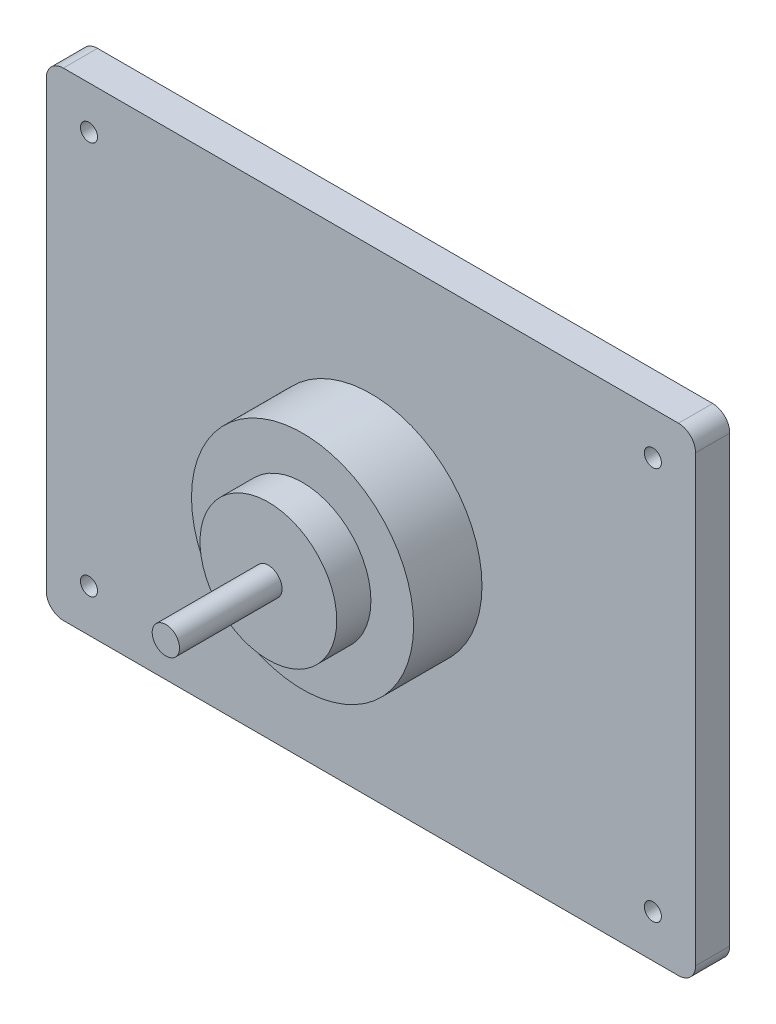
ISO-10303-21;
HEADER;
FILE_DESCRIPTION(('STEP AP214'),'2;1');
FILE_NAME('part.step','',(''),(''),'','','');
FILE_SCHEMA(('AUTOMOTIVE_DESIGN { 1 0 10303 214 1 1 1 1 }'));
ENDSEC;
DATA;
#1=APPLICATION_CONTEXT('core data for automotive mechanical design processes');
#2=APPLICATION_PROTOCOL_DEFINITION('international standard','automotive_design',2000,#1);
#3=PRODUCT_CONTEXT('',#1,'mechanical');
#4=PRODUCT('Part','Part','',(#3));
#5=PRODUCT_RELATED_PRODUCT_CATEGORY('part','',(#4));
#6=PRODUCT_DEFINITION_FORMATION('','',#4);
#7=PRODUCT_DEFINITION_CONTEXT('part definition',#1,'design');
#8=PRODUCT_DEFINITION('design','',#6,#7);
#9=PRODUCT_DEFINITION_SHAPE('','',#8);
#10=(LENGTH_UNIT() NAMED_UNIT(*) SI_UNIT(.MILLI.,.METRE.));
#11=(NAMED_UNIT(*) PLANE_ANGLE_UNIT() SI_UNIT($,.RADIAN.));
#12=(NAMED_UNIT(*) SI_UNIT($,.STERADIAN.) SOLID_ANGLE_UNIT());
#13=UNCERTAINTY_MEASURE_WITH_UNIT(LENGTH_MEASURE(1.E-05),#10,'distance_accuracy_value','');
#14=(GEOMETRIC_REPRESENTATION_CONTEXT(3) GLOBAL_UNCERTAINTY_ASSIGNED_CONTEXT((#13)) GLOBAL_UNIT_ASSIGNED_CONTEXT((#10,
#11,#12)) REPRESENTATION_CONTEXT('',''));
#15=CARTESIAN_POINT('',(0.,0.,0.));
#16=DIRECTION('',(0.,0.,1.));
#17=DIRECTION('',(1.,0.,0.));
#18=AXIS2_PLACEMENT_3D('',#15,#16,#17);
#19=CARTESIAN_POINT('',(-95.,-70.,10.));
#20=DIRECTION('',(0.,1.,0.));
#21=DIRECTION('',(0.,0.,1.));
#22=AXIS2_PLACEMENT_3D('',#19,#20,#21);
#23=PLANE('',#22);
#24=DIRECTION('',(1.,0.,0.));
#25=VECTOR('',#24,1.);
#26=CARTESIAN_POINT('',(-95.,-70.,10.));
#27=LINE('',#26,#25);
#28=CARTESIAN_POINT('',(-90.,-70.,10.));
#29=VERTEX_POINT('',#28);
#30=CARTESIAN_POINT('',(90.,-70.,10.));
#31=VERTEX_POINT('',#30);
#32=EDGE_CURVE('E132',#29,#31,#27,.T.);
#33=ORIENTED_EDGE('',*,*,#32,.F.);
#34=DIRECTION('',(0.,0.,-1.));
#35=VECTOR('',#34,1.);
#36=CARTESIAN_POINT('',(-90.,-70.,10.));
#37=LINE('',#36,#35);
#38=CARTESIAN_POINT('',(-90.,-70.,0.));
#39=VERTEX_POINT('',#38);
#40=EDGE_CURVE('E158',#29,#39,#37,.T.);
#41=ORIENTED_EDGE('',*,*,#40,.T.);
#42=DIRECTION('',(1.,0.,0.));
#43=VECTOR('',#42,1.);
#44=CARTESIAN_POINT('',(-95.,-70.,0.));
#45=LINE('',#44,#43);
#46=CARTESIAN_POINT('',(90.,-70.,0.));
#47=VERTEX_POINT('',#46);
#48=EDGE_CURVE('E175',#39,#47,#45,.T.);
#49=ORIENTED_EDGE('',*,*,#48,.T.);
#50=DIRECTION('',(0.,0.,-1.));
#51=VECTOR('',#50,1.);
#52=CARTESIAN_POINT('',(90.,-70.,10.));
#53=LINE('',#52,#51);
#54=EDGE_CURVE('E156',#47,#31,#53,.F.);
#55=ORIENTED_EDGE('',*,*,#54,.T.);
#56=EDGE_LOOP('',(#33,#41,#49,#55));
#57=FACE_BOUND('',#56,.T.);
#58=ADVANCED_FACE('F37',(#57),#23,.F.);
#59=CARTESIAN_POINT('',(95.,70.,10.));
#60=DIRECTION('',(1.,0.,0.));
#61=DIRECTION('',(0.,0.,-1.));
#62=AXIS2_PLACEMENT_3D('',#59,#60,#61);
#63=PLANE('',#62);
#64=DIRECTION('',(0.,-1.,0.));
#65=VECTOR('',#64,1.);
#66=CARTESIAN_POINT('',(95.,70.,10.));
#67=LINE('',#66,#65);
#68=CARTESIAN_POINT('',(95.,65.,10.));
#69=VERTEX_POINT('',#68);
#70=CARTESIAN_POINT('',(95.,-65.,10.));
#71=VERTEX_POINT('',#70);
#72=EDGE_CURVE('E135',#69,#71,#67,.T.);
#73=ORIENTED_EDGE('',*,*,#72,.T.);
#74=DIRECTION('',(0.,0.,-1.));
#75=VECTOR('',#74,1.);
#76=CARTESIAN_POINT('',(95.,-65.,0.));
#77=LINE('',#76,#75);
#78=CARTESIAN_POINT('',(95.,-65.,0.));
#79=VERTEX_POINT('',#78);
#80=EDGE_CURVE('E41',#71,#79,#77,.T.);
#81=ORIENTED_EDGE('',*,*,#80,.T.);
#82=DIRECTION('',(0.,-1.,0.));
#83=VECTOR('',#82,1.);
#84=CARTESIAN_POINT('',(95.,70.,0.));
#85=LINE('',#84,#83);
#86=CARTESIAN_POINT('',(95.,65.,0.));
#87=VERTEX_POINT('',#86);
#88=EDGE_CURVE('E137',#87,#79,#85,.T.);
#89=ORIENTED_EDGE('',*,*,#88,.F.);
#90=DIRECTION('',(0.,0.,-1.));
#91=VECTOR('',#90,1.);
#92=CARTESIAN_POINT('',(95.,65.,10.));
#93=LINE('',#92,#91);
#94=EDGE_CURVE('E61',#87,#69,#93,.F.);
#95=ORIENTED_EDGE('',*,*,#94,.T.);
#96=EDGE_LOOP('',(#73,#81,#89,#95));
#97=FACE_BOUND('',#96,.T.);
#98=ADVANCED_FACE('F177',(#97),#63,.T.);
#99=CARTESIAN_POINT('',(-95.,70.,10.));
#100=DIRECTION('',(0.,1.,0.));
#101=DIRECTION('',(0.,0.,1.));
#102=AXIS2_PLACEMENT_3D('',#99,#100,#101);
#103=PLANE('',#102);
#104=DIRECTION('',(1.,0.,0.));
#105=VECTOR('',#104,1.);
#106=CARTESIAN_POINT('',(-95.,70.,0.));
#107=LINE('',#106,#105);
#108=CARTESIAN_POINT('',(-90.,70.,0.));
#109=VERTEX_POINT('',#108);
#110=CARTESIAN_POINT('',(90.,70.,0.));
#111=VERTEX_POINT('',#110);
#112=EDGE_CURVE('E133',#109,#111,#107,.T.);
#113=ORIENTED_EDGE('',*,*,#112,.F.);
#114=DIRECTION('',(0.,0.,-1.));
#115=VECTOR('',#114,1.);
#116=CARTESIAN_POINT('',(-90.,70.,10.));
#117=LINE('',#116,#115);
#118=CARTESIAN_POINT('',(-90.,70.,10.));
#119=VERTEX_POINT('',#118);
#120=EDGE_CURVE('E111',#109,#119,#117,.F.);
#121=ORIENTED_EDGE('',*,*,#120,.T.);
#122=DIRECTION('',(1.,0.,0.));
#123=VECTOR('',#122,1.);
#124=CARTESIAN_POINT('',(-95.,70.,10.));
#125=LINE('',#124,#123);
#126=CARTESIAN_POINT('',(90.,70.,10.));
#127=VERTEX_POINT('',#126);
#128=EDGE_CURVE('E171',#119,#127,#125,.T.);
#129=ORIENTED_EDGE('',*,*,#128,.T.);
#130=DIRECTION('',(0.,0.,-1.));
#131=VECTOR('',#130,1.);
#132=CARTESIAN_POINT('',(90.,70.,10.));
#133=LINE('',#132,#131);
#134=EDGE_CURVE('E116',#127,#111,#133,.T.);
#135=ORIENTED_EDGE('',*,*,#134,.T.);
#136=EDGE_LOOP('',(#113,#121,#129,#135));
#137=FACE_BOUND('',#136,.T.);
#138=ADVANCED_FACE('F184',(#137),#103,.T.);
#139=CARTESIAN_POINT('',(-95.,70.,10.));
#140=DIRECTION('',(1.,0.,0.));
#141=DIRECTION('',(0.,0.,-1.));
#142=AXIS2_PLACEMENT_3D('',#139,#140,#141);
#143=PLANE('',#142);
#144=DIRECTION('',(0.,-1.,0.));
#145=VECTOR('',#144,1.);
#146=CARTESIAN_POINT('',(-95.,70.,10.));
#147=LINE('',#146,#145);
#148=CARTESIAN_POINT('',(-95.,65.,10.));
#149=VERTEX_POINT('',#148);
#150=CARTESIAN_POINT('',(-95.,-65.,10.));
#151=VERTEX_POINT('',#150);
#152=EDGE_CURVE('E126',#149,#151,#147,.T.);
#153=ORIENTED_EDGE('',*,*,#152,.F.);
#154=DIRECTION('',(0.,0.,-1.));
#155=VECTOR('',#154,1.);
#156=CARTESIAN_POINT('',(-95.,65.,0.));
#157=LINE('',#156,#155);
#158=CARTESIAN_POINT('',(-95.,65.,0.));
#159=VERTEX_POINT('',#158);
#160=EDGE_CURVE('E110',#149,#159,#157,.T.);
#161=ORIENTED_EDGE('',*,*,#160,.T.);
#162=DIRECTION('',(0.,-1.,0.));
#163=VECTOR('',#162,1.);
#164=CARTESIAN_POINT('',(-95.,70.,0.));
#165=LINE('',#164,#163);
#166=CARTESIAN_POINT('',(-95.,-65.,0.));
#167=VERTEX_POINT('',#166);
#168=EDGE_CURVE('E123',#159,#167,#165,.T.);
#169=ORIENTED_EDGE('',*,*,#168,.T.);
#170=DIRECTION('',(0.,0.,-1.));
#171=VECTOR('',#170,1.);
#172=CARTESIAN_POINT('',(-95.,-65.,10.));
#173=LINE('',#172,#171);
#174=EDGE_CURVE('E128',#167,#151,#173,.F.);
#175=ORIENTED_EDGE('',*,*,#174,.T.);
#176=EDGE_LOOP('',(#153,#161,#169,#175));
#177=FACE_BOUND('',#176,.T.);
#178=ADVANCED_FACE('F122',(#177),#143,.F.);
#179=CARTESIAN_POINT('',(0.,0.,10.));
#180=DIRECTION('',(0.,0.,-1.));
#181=DIRECTION('',(-1.,0.,0.));
#182=AXIS2_PLACEMENT_3D('',#179,#180,#181);
#183=PLANE('',#182);
#184=CARTESIAN_POINT('',(-82.5,57.5,10.));
#185=DIRECTION('',(0.,0.,1.));
#186=DIRECTION('',(-1.,0.,0.));
#187=AXIS2_PLACEMENT_3D('',#184,#185,#186);
#188=CIRCLE('',#187,2.50000000000001);
#189=CARTESIAN_POINT('',(-85.,57.5,10.));
#190=VERTEX_POINT('',#189);
#191=EDGE_CURVE('E318',#190,#190,#188,.T.);
#192=ORIENTED_EDGE('',*,*,#191,.F.);
#193=EDGE_LOOP('',(#192));
#194=FACE_BOUND('',#193,.T.);
#195=CARTESIAN_POINT('',(-82.5,-57.5,10.));
#196=DIRECTION('',(0.,0.,1.));
#197=DIRECTION('',(1.,0.,0.));
#198=AXIS2_PLACEMENT_3D('',#195,#196,#197);
#199=CIRCLE('',#198,2.50000000000001);
#200=CARTESIAN_POINT('',(-80.,-57.5,10.));
#201=VERTEX_POINT('',#200);
#202=EDGE_CURVE('E313',#201,#201,#199,.T.);
#203=ORIENTED_EDGE('',*,*,#202,.F.);
#204=EDGE_LOOP('',(#203));
#205=FACE_BOUND('',#204,.T.);
#206=CARTESIAN_POINT('',(82.5,-57.5,10.));
#207=DIRECTION('',(0.,0.,1.));
#208=DIRECTION('',(-1.,0.,0.));
#209=AXIS2_PLACEMENT_3D('',#206,#207,#208);
#210=CIRCLE('',#209,2.50000000000001);
#211=CARTESIAN_POINT('',(80.,-57.5,10.));
#212=VERTEX_POINT('',#211);
#213=EDGE_CURVE('E260',#212,#212,#210,.T.);
#214=ORIENTED_EDGE('',*,*,#213,.F.);
#215=EDGE_LOOP('',(#214));
#216=FACE_BOUND('',#215,.T.);
#217=CARTESIAN_POINT('',(82.5,57.5,10.));
#218=DIRECTION('',(0.,0.,1.));
#219=DIRECTION('',(1.,0.,0.));
#220=AXIS2_PLACEMENT_3D('',#217,#218,#219);
#221=CIRCLE('',#220,2.50000000000001);
#222=CARTESIAN_POINT('',(85.,57.5,10.));
#223=VERTEX_POINT('',#222);
#224=EDGE_CURVE('E254',#223,#223,#221,.T.);
#225=ORIENTED_EDGE('',*,*,#224,.F.);
#226=EDGE_LOOP('',(#225));
#227=FACE_BOUND('',#226,.T.);
#228=CARTESIAN_POINT('',(0.,0.,10.));
#229=DIRECTION('',(0.,0.,1.));
#230=DIRECTION('',(1.,0.,0.));
#231=AXIS2_PLACEMENT_3D('',#228,#229,#230);
#232=CIRCLE('',#231,32.5);
#233=CARTESIAN_POINT('',(32.5,0.,10.));
#234=VERTEX_POINT('',#233);
#235=EDGE_CURVE('E46',#234,#234,#232,.T.);
#236=ORIENTED_EDGE('',*,*,#235,.F.);
#237=EDGE_LOOP('',(#236));
#238=FACE_BOUND('',#237,.T.);
#239=ORIENTED_EDGE('',*,*,#128,.F.);
#240=CARTESIAN_POINT('',(-90.,65.,10.));
#241=DIRECTION('',(0.,0.,-1.));
#242=DIRECTION('',(-1.,0.,0.));
#243=AXIS2_PLACEMENT_3D('',#240,#241,#242);
#244=CIRCLE('',#243,5.);
#245=EDGE_CURVE('E154',#119,#149,#244,.F.);
#246=ORIENTED_EDGE('',*,*,#245,.T.);
#247=ORIENTED_EDGE('',*,*,#152,.T.);
#248=CARTESIAN_POINT('',(-90.,-65.,10.));
#249=DIRECTION('',(0.,0.,-1.));
#250=DIRECTION('',(-1.,0.,0.));
#251=AXIS2_PLACEMENT_3D('',#248,#249,#250);
#252=CIRCLE('',#251,5.);
#253=EDGE_CURVE('E152',#151,#29,#252,.F.);
#254=ORIENTED_EDGE('',*,*,#253,.T.);
#255=ORIENTED_EDGE('',*,*,#32,.T.);
#256=CARTESIAN_POINT('',(90.,-65.,10.));
#257=DIRECTION('',(0.,0.,-1.));
#258=DIRECTION('',(-1.,0.,0.));
#259=AXIS2_PLACEMENT_3D('',#256,#257,#258);
#260=CIRCLE('',#259,5.);
#261=EDGE_CURVE('E54',#31,#71,#260,.F.);
#262=ORIENTED_EDGE('',*,*,#261,.T.);
#263=ORIENTED_EDGE('',*,*,#72,.F.);
#264=CARTESIAN_POINT('',(90.,65.,10.));
#265=DIRECTION('',(0.,0.,-1.));
#266=DIRECTION('',(-1.,0.,0.));
#267=AXIS2_PLACEMENT_3D('',#264,#265,#266);
#268=CIRCLE('',#267,5.);
#269=EDGE_CURVE('E149',#69,#127,#268,.F.);
#270=ORIENTED_EDGE('',*,*,#269,.T.);
#271=EDGE_LOOP('',(#239,#246,#247,#254,#255,#262,#263,#270));
#272=FACE_BOUND('',#271,.T.);
#273=ADVANCED_FACE('F182',(#194,#205,#216,#227,#238,#272),#183,.F.);
#274=CARTESIAN_POINT('',(0.,0.,0.));
#275=DIRECTION('',(0.,0.,-1.));
#276=DIRECTION('',(-1.,0.,0.));
#277=AXIS2_PLACEMENT_3D('',#274,#275,#276);
#278=PLANE('',#277);
#279=CARTESIAN_POINT('',(-82.5,57.5,0.));
#280=DIRECTION('',(0.,0.,1.));
#281=DIRECTION('',(-1.,0.,0.));
#282=AXIS2_PLACEMENT_3D('',#279,#280,#281);
#283=CIRCLE('',#282,2.50000000000001);
#284=CARTESIAN_POINT('',(-85.,57.5,0.));
#285=VERTEX_POINT('',#284);
#286=EDGE_CURVE('E240',#285,#285,#283,.T.);
#287=ORIENTED_EDGE('',*,*,#286,.T.);
#288=EDGE_LOOP('',(#287));
#289=FACE_BOUND('',#288,.T.);
#290=CARTESIAN_POINT('',(-82.5,-57.5,0.));
#291=DIRECTION('',(0.,0.,1.));
#292=DIRECTION('',(1.,0.,0.));
#293=AXIS2_PLACEMENT_3D('',#290,#291,#292);
#294=CIRCLE('',#293,2.50000000000001);
#295=CARTESIAN_POINT('',(-80.,-57.5,0.));
#296=VERTEX_POINT('',#295);
#297=EDGE_CURVE('E244',#296,#296,#294,.T.);
#298=ORIENTED_EDGE('',*,*,#297,.T.);
#299=EDGE_LOOP('',(#298));
#300=FACE_BOUND('',#299,.T.);
#301=CARTESIAN_POINT('',(82.5,-57.5,0.));
#302=DIRECTION('',(0.,0.,1.));
#303=DIRECTION('',(-1.,0.,0.));
#304=AXIS2_PLACEMENT_3D('',#301,#302,#303);
#305=CIRCLE('',#304,2.50000000000001);
#306=CARTESIAN_POINT('',(80.,-57.5,0.));
#307=VERTEX_POINT('',#306);
#308=EDGE_CURVE('E248',#307,#307,#305,.T.);
#309=ORIENTED_EDGE('',*,*,#308,.T.);
#310=EDGE_LOOP('',(#309));
#311=FACE_BOUND('',#310,.T.);
#312=CARTESIAN_POINT('',(82.5,57.5,0.));
#313=DIRECTION('',(0.,0.,1.));
#314=DIRECTION('',(1.,0.,0.));
#315=AXIS2_PLACEMENT_3D('',#312,#313,#314);
#316=CIRCLE('',#315,2.50000000000001);
#317=CARTESIAN_POINT('',(85.,57.5,0.));
#318=VERTEX_POINT('',#317);
#319=EDGE_CURVE('E251',#318,#318,#316,.T.);
#320=ORIENTED_EDGE('',*,*,#319,.T.);
#321=EDGE_LOOP('',(#320));
#322=FACE_BOUND('',#321,.T.);
#323=ORIENTED_EDGE('',*,*,#168,.F.);
#324=CARTESIAN_POINT('',(-90.,65.,0.));
#325=DIRECTION('',(0.,0.,-1.));
#326=DIRECTION('',(-1.,0.,0.));
#327=AXIS2_PLACEMENT_3D('',#324,#325,#326);
#328=CIRCLE('',#327,5.);
#329=EDGE_CURVE('E106',#159,#109,#328,.T.);
#330=ORIENTED_EDGE('',*,*,#329,.T.);
#331=ORIENTED_EDGE('',*,*,#112,.T.);
#332=CARTESIAN_POINT('',(90.,65.,0.));
#333=DIRECTION('',(0.,0.,-1.));
#334=DIRECTION('',(-1.,0.,0.));
#335=AXIS2_PLACEMENT_3D('',#332,#333,#334);
#336=CIRCLE('',#335,5.);
#337=EDGE_CURVE('E127',#111,#87,#336,.T.);
#338=ORIENTED_EDGE('',*,*,#337,.T.);
#339=ORIENTED_EDGE('',*,*,#88,.T.);
#340=CARTESIAN_POINT('',(90.,-65.,0.));
#341=DIRECTION('',(0.,0.,-1.));
#342=DIRECTION('',(-1.,0.,0.));
#343=AXIS2_PLACEMENT_3D('',#340,#341,#342);
#344=CIRCLE('',#343,5.);
#345=EDGE_CURVE('E143',#79,#47,#344,.T.);
#346=ORIENTED_EDGE('',*,*,#345,.T.);
#347=ORIENTED_EDGE('',*,*,#48,.F.);
#348=CARTESIAN_POINT('',(-90.,-65.,0.));
#349=DIRECTION('',(0.,0.,-1.));
#350=DIRECTION('',(-1.,0.,0.));
#351=AXIS2_PLACEMENT_3D('',#348,#349,#350);
#352=CIRCLE('',#351,5.);
#353=EDGE_CURVE('E117',#39,#167,#352,.T.);
#354=ORIENTED_EDGE('',*,*,#353,.T.);
#355=EDGE_LOOP('',(#323,#330,#331,#338,#339,#346,#347,#354));
#356=FACE_BOUND('',#355,.T.);
#357=ADVANCED_FACE('F130',(#289,#300,#311,#322,#356),#278,.T.);
#358=CARTESIAN_POINT('',(-90.,65.,10.));
#359=DIRECTION('',(0.,0.,1.));
#360=DIRECTION('',(1.,0.,0.));
#361=AXIS2_PLACEMENT_3D('',#358,#359,#360);
#362=CYLINDRICAL_SURFACE('',#361,5.);
#363=ORIENTED_EDGE('',*,*,#245,.F.);
#364=ORIENTED_EDGE('',*,*,#120,.F.);
#365=ORIENTED_EDGE('',*,*,#329,.F.);
#366=ORIENTED_EDGE('',*,*,#160,.F.);
#367=EDGE_LOOP('',(#363,#364,#365,#366));
#368=FACE_BOUND('',#367,.T.);
#369=ADVANCED_FACE('F109',(#368),#362,.T.);
#370=CARTESIAN_POINT('',(-90.,-65.,10.));
#371=DIRECTION('',(0.,0.,-1.));
#372=DIRECTION('',(-1.,0.,0.));
#373=AXIS2_PLACEMENT_3D('',#370,#371,#372);
#374=CYLINDRICAL_SURFACE('',#373,5.);
#375=ORIENTED_EDGE('',*,*,#253,.F.);
#376=ORIENTED_EDGE('',*,*,#174,.F.);
#377=ORIENTED_EDGE('',*,*,#353,.F.);
#378=ORIENTED_EDGE('',*,*,#40,.F.);
#379=EDGE_LOOP('',(#375,#376,#377,#378));
#380=FACE_BOUND('',#379,.T.);
#381=ADVANCED_FACE('F202',(#380),#374,.T.);
#382=CARTESIAN_POINT('',(90.,-65.,10.));
#383=DIRECTION('',(0.,0.,1.));
#384=DIRECTION('',(1.,0.,0.));
#385=AXIS2_PLACEMENT_3D('',#382,#383,#384);
#386=CYLINDRICAL_SURFACE('',#385,5.);
#387=ORIENTED_EDGE('',*,*,#261,.F.);
#388=ORIENTED_EDGE('',*,*,#54,.F.);
#389=ORIENTED_EDGE('',*,*,#345,.F.);
#390=ORIENTED_EDGE('',*,*,#80,.F.);
#391=EDGE_LOOP('',(#387,#388,#389,#390));
#392=FACE_BOUND('',#391,.T.);
#393=ADVANCED_FACE('F204',(#392),#386,.T.);
#394=CARTESIAN_POINT('',(90.,65.,10.));
#395=DIRECTION('',(0.,0.,-1.));
#396=DIRECTION('',(-1.,0.,0.));
#397=AXIS2_PLACEMENT_3D('',#394,#395,#396);
#398=CYLINDRICAL_SURFACE('',#397,5.);
#399=ORIENTED_EDGE('',*,*,#269,.F.);
#400=ORIENTED_EDGE('',*,*,#94,.F.);
#401=ORIENTED_EDGE('',*,*,#337,.F.);
#402=ORIENTED_EDGE('',*,*,#134,.F.);
#403=EDGE_LOOP('',(#399,#400,#401,#402));
#404=FACE_BOUND('',#403,.T.);
#405=ADVANCED_FACE('F39',(#404),#398,.T.);
#406=CARTESIAN_POINT('',(0.,0.,30.));
#407=DIRECTION('',(0.,0.,-1.));
#408=DIRECTION('',(-1.,0.,0.));
#409=AXIS2_PLACEMENT_3D('',#406,#407,#408);
#410=CYLINDRICAL_SURFACE('',#409,32.5);
#411=CARTESIAN_POINT('',(0.,0.,30.));
#412=DIRECTION('',(0.,0.,1.));
#413=DIRECTION('',(1.,0.,0.));
#414=AXIS2_PLACEMENT_3D('',#411,#412,#413);
#415=CIRCLE('',#414,32.5);
#416=CARTESIAN_POINT('',(32.5,0.,30.));
#417=VERTEX_POINT('',#416);
#418=EDGE_CURVE('E168',#417,#417,#415,.T.);
#419=ORIENTED_EDGE('',*,*,#418,.F.);
#420=EDGE_LOOP('',(#419));
#421=FACE_BOUND('',#420,.T.);
#422=ORIENTED_EDGE('',*,*,#235,.T.);
#423=EDGE_LOOP('',(#422));
#424=FACE_BOUND('',#423,.T.);
#425=ADVANCED_FACE('F211',(#421,#424),#410,.T.);
#426=CARTESIAN_POINT('',(0.,0.,30.));
#427=DIRECTION('',(0.,0.,1.));
#428=DIRECTION('',(1.,0.,0.));
#429=AXIS2_PLACEMENT_3D('',#426,#427,#428);
#430=PLANE('',#429);
#431=CARTESIAN_POINT('',(0.,0.,30.));
#432=DIRECTION('',(0.,0.,1.));
#433=DIRECTION('',(1.,0.,0.));
#434=AXIS2_PLACEMENT_3D('',#431,#432,#433);
#435=CIRCLE('',#434,20.);
#436=CARTESIAN_POINT('',(20.,0.,30.));
#437=VERTEX_POINT('',#436);
#438=EDGE_CURVE('E11',#437,#437,#435,.T.);
#439=ORIENTED_EDGE('',*,*,#438,.F.);
#440=EDGE_LOOP('',(#439));
#441=FACE_BOUND('',#440,.T.);
#442=ORIENTED_EDGE('',*,*,#418,.T.);
#443=EDGE_LOOP('',(#442));
#444=FACE_BOUND('',#443,.T.);
#445=ADVANCED_FACE('F218',(#441,#444),#430,.T.);
#446=CARTESIAN_POINT('',(0.,0.,40.));
#447=DIRECTION('',(0.,0.,-1.));
#448=DIRECTION('',(-1.,0.,0.));
#449=AXIS2_PLACEMENT_3D('',#446,#447,#448);
#450=CYLINDRICAL_SURFACE('',#449,20.);
#451=CARTESIAN_POINT('',(0.,0.,40.));
#452=DIRECTION('',(0.,0.,1.));
#453=DIRECTION('',(1.,0.,0.));
#454=AXIS2_PLACEMENT_3D('',#451,#452,#453);
#455=CIRCLE('',#454,20.);
#456=CARTESIAN_POINT('',(20.,0.,40.));
#457=VERTEX_POINT('',#456);
#458=EDGE_CURVE('E267',#457,#457,#455,.T.);
#459=ORIENTED_EDGE('',*,*,#458,.F.);
#460=EDGE_LOOP('',(#459));
#461=FACE_BOUND('',#460,.T.);
#462=ORIENTED_EDGE('',*,*,#438,.T.);
#463=EDGE_LOOP('',(#462));
#464=FACE_BOUND('',#463,.T.);
#465=ADVANCED_FACE('F224',(#461,#464),#450,.T.);
#466=CARTESIAN_POINT('',(0.,0.,40.));
#467=DIRECTION('',(0.,0.,1.));
#468=DIRECTION('',(1.,0.,0.));
#469=AXIS2_PLACEMENT_3D('',#466,#467,#468);
#470=PLANE('',#469);
#471=ORIENTED_EDGE('',*,*,#458,.T.);
#472=EDGE_LOOP('',(#471));
#473=FACE_BOUND('',#472,.T.);
#474=CARTESIAN_POINT('',(0.,0.,40.));
#475=DIRECTION('',(0.,0.,1.));
#476=DIRECTION('',(1.,0.,0.));
#477=AXIS2_PLACEMENT_3D('',#474,#475,#476);
#478=CIRCLE('',#477,4.);
#479=CARTESIAN_POINT('',(4.,0.,40.));
#480=VERTEX_POINT('',#479);
#481=EDGE_CURVE('E257',#480,#480,#478,.T.);
#482=ORIENTED_EDGE('',*,*,#481,.F.);
#483=EDGE_LOOP('',(#482));
#484=FACE_BOUND('',#483,.T.);
#485=ADVANCED_FACE('F273',(#473,#484),#470,.T.);
#486=CARTESIAN_POINT('',(0.,0.,50.));
#487=DIRECTION('',(0.,0.,1.));
#488=DIRECTION('',(1.,0.,0.));
#489=AXIS2_PLACEMENT_3D('',#486,#487,#488);
#490=CYLINDRICAL_SURFACE('',#489,4.);
#491=ORIENTED_EDGE('',*,*,#481,.T.);
#492=EDGE_LOOP('',(#491));
#493=FACE_BOUND('',#492,.T.);
#494=CARTESIAN_POINT('',(0.,0.,70.));
#495=DIRECTION('',(0.,0.,1.));
#496=DIRECTION('',(1.,0.,0.));
#497=AXIS2_PLACEMENT_3D('',#494,#495,#496);
#498=CIRCLE('',#497,4.);
#499=CARTESIAN_POINT('',(4.,0.,70.));
#500=VERTEX_POINT('',#499);
#501=EDGE_CURVE('E253',#500,#500,#498,.T.);
#502=ORIENTED_EDGE('',*,*,#501,.F.);
#503=EDGE_LOOP('',(#502));
#504=FACE_BOUND('',#503,.T.);
#505=ADVANCED_FACE('F282',(#493,#504),#490,.T.);
#506=CARTESIAN_POINT('',(0.,0.,70.));
#507=DIRECTION('',(0.,0.,1.));
#508=DIRECTION('',(1.,0.,0.));
#509=AXIS2_PLACEMENT_3D('',#506,#507,#508);
#510=PLANE('',#509);
#511=ORIENTED_EDGE('',*,*,#501,.T.);
#512=EDGE_LOOP('',(#511));
#513=FACE_BOUND('',#512,.T.);
#514=ADVANCED_FACE('F287',(#513),#510,.T.);
#515=CARTESIAN_POINT('',(82.5,57.5,0.));
#516=DIRECTION('',(0.,0.,1.));
#517=DIRECTION('',(1.,0.,0.));
#518=AXIS2_PLACEMENT_3D('',#515,#516,#517);
#519=CYLINDRICAL_SURFACE('',#518,2.50000000000001);
#520=ORIENTED_EDGE('',*,*,#319,.F.);
#521=EDGE_LOOP('',(#520));
#522=FACE_BOUND('',#521,.T.);
#523=ORIENTED_EDGE('',*,*,#224,.T.);
#524=EDGE_LOOP('',(#523));
#525=FACE_BOUND('',#524,.T.);
#526=ADVANCED_FACE('F291',(#522,#525),#519,.F.);
#527=CARTESIAN_POINT('',(82.5,-57.5,0.));
#528=DIRECTION('',(0.,0.,1.));
#529=DIRECTION('',(1.,0.,0.));
#530=AXIS2_PLACEMENT_3D('',#527,#528,#529);
#531=CYLINDRICAL_SURFACE('',#530,2.50000000000001);
#532=ORIENTED_EDGE('',*,*,#308,.F.);
#533=EDGE_LOOP('',(#532));
#534=FACE_BOUND('',#533,.T.);
#535=ORIENTED_EDGE('',*,*,#213,.T.);
#536=EDGE_LOOP('',(#535));
#537=FACE_BOUND('',#536,.T.);
#538=ADVANCED_FACE('F295',(#534,#537),#531,.F.);
#539=CARTESIAN_POINT('',(-82.5,-57.5,0.));
#540=DIRECTION('',(0.,0.,1.));
#541=DIRECTION('',(1.,0.,0.));
#542=AXIS2_PLACEMENT_3D('',#539,#540,#541);
#543=CYLINDRICAL_SURFACE('',#542,2.50000000000001);
#544=ORIENTED_EDGE('',*,*,#297,.F.);
#545=EDGE_LOOP('',(#544));
#546=FACE_BOUND('',#545,.T.);
#547=ORIENTED_EDGE('',*,*,#202,.T.);
#548=EDGE_LOOP('',(#547));
#549=FACE_BOUND('',#548,.T.);
#550=ADVANCED_FACE('F299',(#546,#549),#543,.F.);
#551=CARTESIAN_POINT('',(-82.5,57.5,0.));
#552=DIRECTION('',(0.,0.,1.));
#553=DIRECTION('',(1.,0.,0.));
#554=AXIS2_PLACEMENT_3D('',#551,#552,#553);
#555=CYLINDRICAL_SURFACE('',#554,2.50000000000001);
#556=ORIENTED_EDGE('',*,*,#286,.F.);
#557=EDGE_LOOP('',(#556));
#558=FACE_BOUND('',#557,.T.);
#559=ORIENTED_EDGE('',*,*,#191,.T.);
#560=EDGE_LOOP('',(#559));
#561=FACE_BOUND('',#560,.T.);
#562=ADVANCED_FACE('F296',(#558,#561),#555,.F.);
#563=CLOSED_SHELL('',(#58,#98,#138,#178,#273,#357,#369,#381,#393,#405,#425,#445,#465,#485,#505,
#514,#526,#538,#550,#562));
#564=MANIFOLD_SOLID_BREP('B2',#563);
#565=ADVANCED_BREP_SHAPE_REPRESENTATION('',(#18,#564),#14);
#566=SHAPE_DEFINITION_REPRESENTATION(#9,#565);
ENDSEC;
END-ISO-10303-21;
